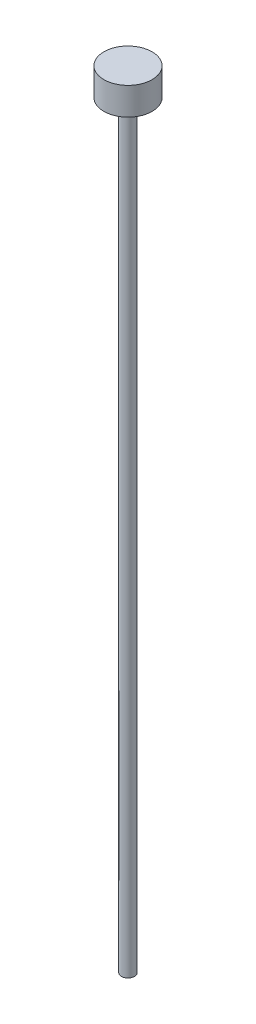
ISO-10303-21;
HEADER;
FILE_DESCRIPTION(('STEP AP214'),'2;1');
FILE_NAME('part.step','',(''),(''),'','','');
FILE_SCHEMA(('AUTOMOTIVE_DESIGN { 1 0 10303 214 1 1 1 1 }'));
ENDSEC;
DATA;
#1=APPLICATION_CONTEXT('core data for automotive mechanical design processes');
#2=APPLICATION_PROTOCOL_DEFINITION('international standard','automotive_design',2000,#1);
#3=PRODUCT_CONTEXT('',#1,'mechanical');
#4=PRODUCT('Part','Part','',(#3));
#5=PRODUCT_RELATED_PRODUCT_CATEGORY('part','',(#4));
#6=PRODUCT_DEFINITION_FORMATION('','',#4);
#7=PRODUCT_DEFINITION_CONTEXT('part definition',#1,'design');
#8=PRODUCT_DEFINITION('design','',#6,#7);
#9=PRODUCT_DEFINITION_SHAPE('','',#8);
#10=(LENGTH_UNIT() NAMED_UNIT(*) SI_UNIT(.MILLI.,.METRE.));
#11=(NAMED_UNIT(*) PLANE_ANGLE_UNIT() SI_UNIT($,.RADIAN.));
#12=(NAMED_UNIT(*) SI_UNIT($,.STERADIAN.) SOLID_ANGLE_UNIT());
#13=UNCERTAINTY_MEASURE_WITH_UNIT(LENGTH_MEASURE(1.E-05),#10,'distance_accuracy_value','');
#14=(GEOMETRIC_REPRESENTATION_CONTEXT(3) GLOBAL_UNCERTAINTY_ASSIGNED_CONTEXT((#13)) GLOBAL_UNIT_ASSIGNED_CONTEXT((#10,
#11,#12)) REPRESENTATION_CONTEXT('',''));
#15=CARTESIAN_POINT('',(0.,0.,0.));
#16=DIRECTION('',(0.,0.,1.));
#17=DIRECTION('',(1.,0.,0.));
#18=AXIS2_PLACEMENT_3D('',#15,#16,#17);
#19=CARTESIAN_POINT('',(0.,110.,0.));
#20=DIRECTION('',(0.,-1.,0.));
#21=DIRECTION('',(0.,0.,-1.));
#22=AXIS2_PLACEMENT_3D('',#19,#20,#21);
#23=CYLINDRICAL_SURFACE('',#22,0.95);
#24=CARTESIAN_POINT('',(0.,109.,0.));
#25=DIRECTION('',(0.,1.,0.));
#26=DIRECTION('',(0.,0.,1.));
#27=AXIS2_PLACEMENT_3D('',#24,#25,#26);
#28=CIRCLE('',#27,0.95);
#29=CARTESIAN_POINT('',(0.,109.,0.95));
#30=VERTEX_POINT('',#29);
#31=EDGE_CURVE('E10',#30,#30,#28,.F.);
#32=ORIENTED_EDGE('',*,*,#31,.T.);
#33=EDGE_LOOP('',(#32));
#34=FACE_BOUND('',#33,.T.);
#35=CARTESIAN_POINT('',(0.,0.,0.));
#36=DIRECTION('',(0.,1.,0.));
#37=DIRECTION('',(0.,0.,1.));
#38=AXIS2_PLACEMENT_3D('',#35,#36,#37);
#39=CIRCLE('',#38,0.95);
#40=CARTESIAN_POINT('',(0.,0.,0.95));
#41=VERTEX_POINT('',#40);
#42=EDGE_CURVE('E52',#41,#41,#39,.T.);
#43=ORIENTED_EDGE('',*,*,#42,.T.);
#44=EDGE_LOOP('',(#43));
#45=FACE_BOUND('',#44,.T.);
#46=ADVANCED_FACE('F39',(#34,#45),#23,.T.);
#47=CARTESIAN_POINT('',(0.,0.,0.));
#48=DIRECTION('',(0.,1.,0.));
#49=DIRECTION('',(0.,0.,1.));
#50=AXIS2_PLACEMENT_3D('',#47,#48,#49);
#51=PLANE('',#50);
#52=ORIENTED_EDGE('',*,*,#42,.F.);
#53=EDGE_LOOP('',(#52));
#54=FACE_BOUND('',#53,.T.);
#55=ADVANCED_FACE('F73',(#54),#51,.F.);
#56=CARTESIAN_POINT('',(0.,114.,0.));
#57=DIRECTION('',(0.,-1.,0.));
#58=DIRECTION('',(0.,0.,-1.));
#59=AXIS2_PLACEMENT_3D('',#56,#57,#58);
#60=CYLINDRICAL_SURFACE('',#59,3.5);
#61=CARTESIAN_POINT('',(0.,114.,0.));
#62=DIRECTION('',(0.,1.,0.));
#63=DIRECTION('',(0.,0.,1.));
#64=AXIS2_PLACEMENT_3D('',#61,#62,#63);
#65=CIRCLE('',#64,3.5);
#66=CARTESIAN_POINT('',(0.,114.,3.5));
#67=VERTEX_POINT('',#66);
#68=EDGE_CURVE('E57',#67,#67,#65,.T.);
#69=ORIENTED_EDGE('',*,*,#68,.F.);
#70=EDGE_LOOP('',(#69));
#71=FACE_BOUND('',#70,.T.);
#72=CARTESIAN_POINT('',(0.,110.,0.));
#73=DIRECTION('',(0.,1.,0.));
#74=DIRECTION('',(0.,0.,1.));
#75=AXIS2_PLACEMENT_3D('',#72,#73,#74);
#76=CIRCLE('',#75,3.5);
#77=CARTESIAN_POINT('',(0.,110.,3.5));
#78=VERTEX_POINT('',#77);
#79=EDGE_CURVE('E60',#78,#78,#76,.T.);
#80=ORIENTED_EDGE('',*,*,#79,.T.);
#81=EDGE_LOOP('',(#80));
#82=FACE_BOUND('',#81,.T.);
#83=ADVANCED_FACE('F70',(#71,#82),#60,.T.);
#84=CARTESIAN_POINT('',(0.,114.,0.));
#85=DIRECTION('',(0.,1.,0.));
#86=DIRECTION('',(0.,0.,1.));
#87=AXIS2_PLACEMENT_3D('',#84,#85,#86);
#88=PLANE('',#87);
#89=ORIENTED_EDGE('',*,*,#68,.T.);
#90=EDGE_LOOP('',(#89));
#91=FACE_BOUND('',#90,.T.);
#92=ADVANCED_FACE('F68',(#91),#88,.T.);
#93=CARTESIAN_POINT('',(0.,110.,0.));
#94=DIRECTION('',(0.,1.,0.));
#95=DIRECTION('',(0.,0.,1.));
#96=AXIS2_PLACEMENT_3D('',#93,#94,#95);
#97=PLANE('',#96);
#98=CARTESIAN_POINT('',(0.,110.,0.));
#99=DIRECTION('',(0.,1.,0.));
#100=DIRECTION('',(0.,0.,1.));
#101=AXIS2_PLACEMENT_3D('',#98,#99,#100);
#102=CIRCLE('',#101,1.95);
#103=CARTESIAN_POINT('',(0.,110.,1.95));
#104=VERTEX_POINT('',#103);
#105=EDGE_CURVE('E47',#104,#104,#102,.T.);
#106=ORIENTED_EDGE('',*,*,#105,.T.);
#107=EDGE_LOOP('',(#106));
#108=FACE_BOUND('',#107,.T.);
#109=ORIENTED_EDGE('',*,*,#79,.F.);
#110=EDGE_LOOP('',(#109));
#111=FACE_BOUND('',#110,.T.);
#112=ADVANCED_FACE('F77',(#108,#111),#97,.F.);
#113=CARTESIAN_POINT('',(0.,109.,0.));
#114=DIRECTION('',(0.,1.,0.));
#115=DIRECTION('',(0.,0.,1.));
#116=AXIS2_PLACEMENT_3D('',#113,#114,#115);
#117=TOROIDAL_SURFACE('',#116,1.95,1.);
#118=ORIENTED_EDGE('',*,*,#31,.F.);
#119=EDGE_LOOP('',(#118));
#120=FACE_BOUND('',#119,.T.);
#121=ORIENTED_EDGE('',*,*,#105,.F.);
#122=EDGE_LOOP('',(#121));
#123=FACE_BOUND('',#122,.T.);
#124=ADVANCED_FACE('F41',(#120,#123),#117,.F.);
#125=CLOSED_SHELL('',(#46,#55,#83,#92,#112,#124));
#126=MANIFOLD_SOLID_BREP('B2',#125);
#127=ADVANCED_BREP_SHAPE_REPRESENTATION('',(#18,#126),#14);
#128=SHAPE_DEFINITION_REPRESENTATION(#9,#127);
ENDSEC;
END-ISO-10303-21;
